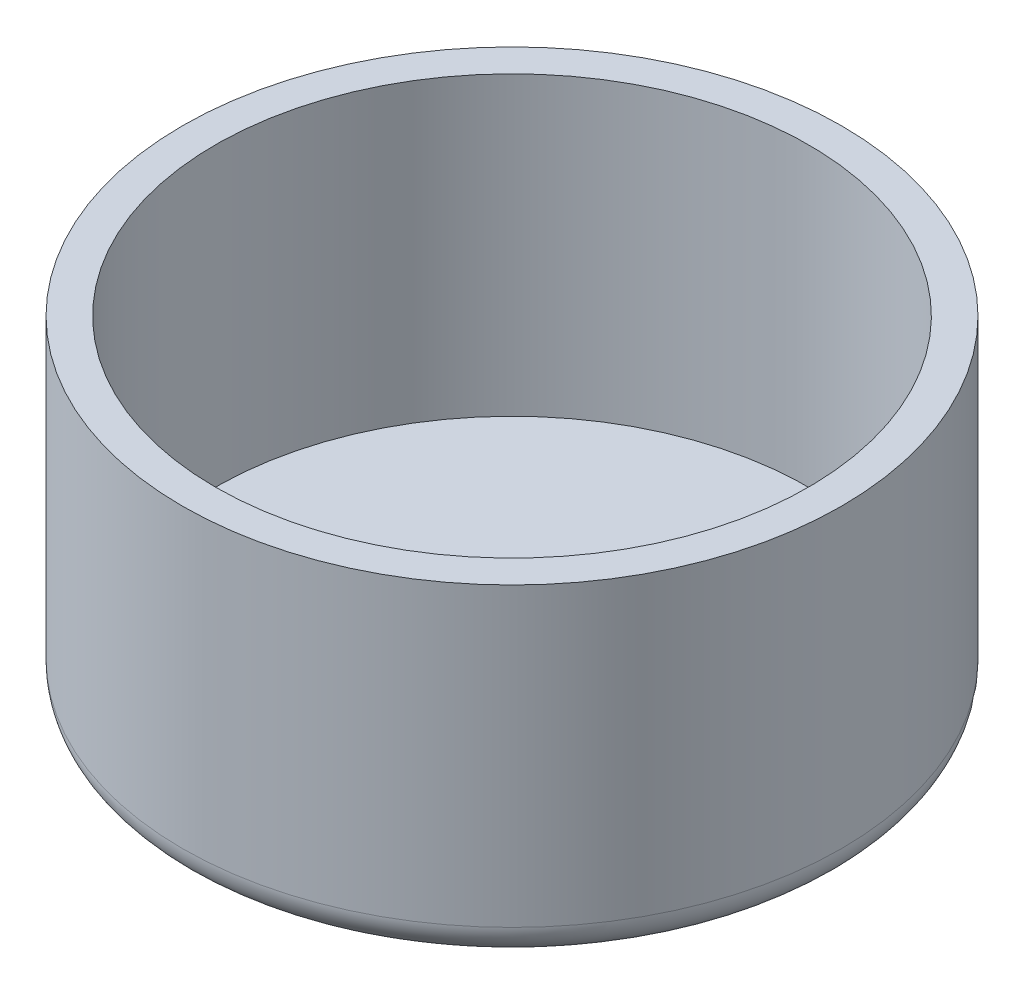
ISO-10303-21;
HEADER;
FILE_DESCRIPTION(('STEP AP214'),'2;1');
FILE_NAME('part.step','',(''),(''),'','','');
FILE_SCHEMA(('AUTOMOTIVE_DESIGN { 1 0 10303 214 1 1 1 1 }'));
ENDSEC;
DATA;
#1=APPLICATION_CONTEXT('core data for automotive mechanical design processes');
#2=APPLICATION_PROTOCOL_DEFINITION('international standard','automotive_design',2000,#1);
#3=PRODUCT_CONTEXT('',#1,'mechanical');
#4=PRODUCT('Part','Part','',(#3));
#5=PRODUCT_RELATED_PRODUCT_CATEGORY('part','',(#4));
#6=PRODUCT_DEFINITION_FORMATION('','',#4);
#7=PRODUCT_DEFINITION_CONTEXT('part definition',#1,'design');
#8=PRODUCT_DEFINITION('design','',#6,#7);
#9=PRODUCT_DEFINITION_SHAPE('','',#8);
#10=(LENGTH_UNIT() NAMED_UNIT(*) SI_UNIT(.MILLI.,.METRE.));
#11=(NAMED_UNIT(*) PLANE_ANGLE_UNIT() SI_UNIT($,.RADIAN.));
#12=(NAMED_UNIT(*) SI_UNIT($,.STERADIAN.) SOLID_ANGLE_UNIT());
#13=UNCERTAINTY_MEASURE_WITH_UNIT(LENGTH_MEASURE(1.E-05),#10,'distance_accuracy_value','');
#14=(GEOMETRIC_REPRESENTATION_CONTEXT(3) GLOBAL_UNCERTAINTY_ASSIGNED_CONTEXT((#13)) GLOBAL_UNIT_ASSIGNED_CONTEXT((#10,
#11,#12)) REPRESENTATION_CONTEXT('',''));
#15=CARTESIAN_POINT('',(0.,0.,0.));
#16=DIRECTION('',(0.,0.,1.));
#17=DIRECTION('',(1.,0.,0.));
#18=AXIS2_PLACEMENT_3D('',#15,#16,#17);
#19=CARTESIAN_POINT('',(0.,100.,0.));
#20=DIRECTION('',(0.,-1.,0.));
#21=DIRECTION('',(0.,0.,-1.));
#22=AXIS2_PLACEMENT_3D('',#19,#20,#21);
#23=CYLINDRICAL_SURFACE('',#22,100.);
#24=CARTESIAN_POINT('',(0.,9.99999999999999,0.));
#25=DIRECTION('',(0.,1.,0.));
#26=DIRECTION('',(0.,0.,1.));
#27=AXIS2_PLACEMENT_3D('',#24,#25,#26);
#28=CIRCLE('',#27,100.);
#29=CARTESIAN_POINT('',(0.,9.99999999999999,100.));
#30=VERTEX_POINT('',#29);
#31=EDGE_CURVE('E48',#30,#30,#28,.T.);
#32=ORIENTED_EDGE('',*,*,#31,.T.);
#33=EDGE_LOOP('',(#32));
#34=FACE_BOUND('',#33,.T.);
#35=CARTESIAN_POINT('',(0.,100.,0.));
#36=DIRECTION('',(0.,1.,0.));
#37=DIRECTION('',(0.,0.,1.));
#38=AXIS2_PLACEMENT_3D('',#35,#36,#37);
#39=CIRCLE('',#38,100.);
#40=CARTESIAN_POINT('',(0.,100.,100.));
#41=VERTEX_POINT('',#40);
#42=EDGE_CURVE('E52',#41,#41,#39,.T.);
#43=ORIENTED_EDGE('',*,*,#42,.F.);
#44=EDGE_LOOP('',(#43));
#45=FACE_BOUND('',#44,.T.);
#46=ADVANCED_FACE('F37',(#34,#45),#23,.T.);
#47=CARTESIAN_POINT('',(0.,100.,0.));
#48=DIRECTION('',(0.,1.,0.));
#49=DIRECTION('',(0.,0.,1.));
#50=AXIS2_PLACEMENT_3D('',#47,#48,#49);
#51=PLANE('',#50);
#52=CARTESIAN_POINT('',(0.,100.,0.));
#53=DIRECTION('',(0.,1.,0.));
#54=DIRECTION('',(0.,0.,1.));
#55=AXIS2_PLACEMENT_3D('',#52,#53,#54);
#56=CIRCLE('',#55,90.);
#57=CARTESIAN_POINT('',(0.,100.,90.));
#58=VERTEX_POINT('',#57);
#59=EDGE_CURVE('E58',#58,#58,#56,.T.);
#60=ORIENTED_EDGE('',*,*,#59,.F.);
#61=EDGE_LOOP('',(#60));
#62=FACE_BOUND('',#61,.T.);
#63=ORIENTED_EDGE('',*,*,#42,.T.);
#64=EDGE_LOOP('',(#63));
#65=FACE_BOUND('',#64,.T.);
#66=ADVANCED_FACE('F98',(#62,#65),#51,.T.);
#67=CARTESIAN_POINT('',(0.,0.,0.));
#68=DIRECTION('',(0.,1.,0.));
#69=DIRECTION('',(0.,0.,1.));
#70=AXIS2_PLACEMENT_3D('',#67,#68,#69);
#71=PLANE('',#70);
#72=CARTESIAN_POINT('',(0.,0.,0.));
#73=DIRECTION('',(0.,1.,0.));
#74=DIRECTION('',(0.,0.,1.));
#75=AXIS2_PLACEMENT_3D('',#72,#73,#74);
#76=CIRCLE('',#75,5.);
#77=CARTESIAN_POINT('',(0.,0.,5.));
#78=VERTEX_POINT('',#77);
#79=EDGE_CURVE('E10',#78,#78,#76,.F.);
#80=ORIENTED_EDGE('',*,*,#79,.F.);
#81=EDGE_LOOP('',(#80));
#82=FACE_BOUND('',#81,.T.);
#83=CARTESIAN_POINT('',(0.,0.,0.));
#84=DIRECTION('',(0.,1.,0.));
#85=DIRECTION('',(0.,0.,1.));
#86=AXIS2_PLACEMENT_3D('',#83,#84,#85);
#87=CIRCLE('',#86,90.);
#88=CARTESIAN_POINT('',(0.,0.,90.));
#89=VERTEX_POINT('',#88);
#90=EDGE_CURVE('E44',#89,#89,#87,.F.);
#91=ORIENTED_EDGE('',*,*,#90,.T.);
#92=EDGE_LOOP('',(#91));
#93=FACE_BOUND('',#92,.T.);
#94=ADVANCED_FACE('F104',(#82,#93),#71,.F.);
#95=CARTESIAN_POINT('',(0.,10.,0.));
#96=DIRECTION('',(0.,1.,0.));
#97=DIRECTION('',(0.,0.,1.));
#98=AXIS2_PLACEMENT_3D('',#95,#96,#97);
#99=CYLINDRICAL_SURFACE('',#98,90.);
#100=CARTESIAN_POINT('',(0.,10.,0.));
#101=DIRECTION('',(0.,1.,0.));
#102=DIRECTION('',(0.,0.,1.));
#103=AXIS2_PLACEMENT_3D('',#100,#101,#102);
#104=CIRCLE('',#103,90.);
#105=CARTESIAN_POINT('',(0.,10.,90.));
#106=VERTEX_POINT('',#105);
#107=EDGE_CURVE('E57',#106,#106,#104,.T.);
#108=CARTESIAN_POINT('',(0.,10.,90.));
#109=CARTESIAN_POINT('',(0.,10.9375,90.));
#110=CARTESIAN_POINT('',(0.,11.875,90.));
#111=CARTESIAN_POINT('',(0.,13.75,90.));
#112=CARTESIAN_POINT('',(0.,14.6875,90.));
#113=CARTESIAN_POINT('',(0.,16.5625,90.));
#114=CARTESIAN_POINT('',(0.,17.5,90.));
#115=CARTESIAN_POINT('',(0.,19.375,90.));
#116=CARTESIAN_POINT('',(0.,20.3125,90.));
#117=CARTESIAN_POINT('',(0.,22.1875,90.));
#118=CARTESIAN_POINT('',(0.,23.125,90.));
#119=CARTESIAN_POINT('',(0.,25.,90.));
#120=CARTESIAN_POINT('',(0.,25.9375,90.));
#121=CARTESIAN_POINT('',(0.,27.8125,90.));
#122=CARTESIAN_POINT('',(0.,28.75,90.));
#123=CARTESIAN_POINT('',(0.,30.625,90.));
#124=CARTESIAN_POINT('',(0.,31.5625,90.));
#125=CARTESIAN_POINT('',(0.,33.4375,90.));
#126=CARTESIAN_POINT('',(0.,34.375,90.));
#127=CARTESIAN_POINT('',(0.,36.25,90.));
#128=CARTESIAN_POINT('',(0.,37.1875,90.));
#129=CARTESIAN_POINT('',(0.,39.0625,90.));
#130=CARTESIAN_POINT('',(0.,40.,90.));
#131=CARTESIAN_POINT('',(0.,41.875,90.));
#132=CARTESIAN_POINT('',(0.,42.8125,90.));
#133=CARTESIAN_POINT('',(0.,44.6875,90.));
#134=CARTESIAN_POINT('',(0.,45.625,90.));
#135=CARTESIAN_POINT('',(0.,47.5,90.));
#136=CARTESIAN_POINT('',(0.,48.4375,90.));
#137=CARTESIAN_POINT('',(0.,50.3125,90.));
#138=CARTESIAN_POINT('',(0.,51.25,90.));
#139=CARTESIAN_POINT('',(0.,53.125,90.));
#140=CARTESIAN_POINT('',(0.,54.0625,90.));
#141=CARTESIAN_POINT('',(0.,55.9375,90.));
#142=CARTESIAN_POINT('',(0.,56.875,90.));
#143=CARTESIAN_POINT('',(0.,58.75,90.));
#144=CARTESIAN_POINT('',(0.,59.6875,90.));
#145=CARTESIAN_POINT('',(0.,61.5625,90.));
#146=CARTESIAN_POINT('',(0.,62.5,90.));
#147=CARTESIAN_POINT('',(0.,64.375,90.));
#148=CARTESIAN_POINT('',(0.,65.3125,90.));
#149=CARTESIAN_POINT('',(0.,67.1875,90.));
#150=CARTESIAN_POINT('',(0.,68.125,90.));
#151=CARTESIAN_POINT('',(0.,70.,90.));
#152=CARTESIAN_POINT('',(0.,70.9375,90.));
#153=CARTESIAN_POINT('',(0.,72.8125,90.));
#154=CARTESIAN_POINT('',(0.,73.75,90.));
#155=CARTESIAN_POINT('',(0.,75.625,90.));
#156=CARTESIAN_POINT('',(0.,76.5625,90.));
#157=CARTESIAN_POINT('',(0.,78.4375,90.));
#158=CARTESIAN_POINT('',(0.,79.375,90.));
#159=CARTESIAN_POINT('',(0.,81.25,90.));
#160=CARTESIAN_POINT('',(0.,82.1875,90.));
#161=CARTESIAN_POINT('',(0.,84.0625,90.));
#162=CARTESIAN_POINT('',(0.,85.,90.));
#163=CARTESIAN_POINT('',(0.,86.875,90.));
#164=CARTESIAN_POINT('',(0.,87.8125,90.));
#165=CARTESIAN_POINT('',(0.,89.6875,90.));
#166=CARTESIAN_POINT('',(0.,90.625,90.));
#167=CARTESIAN_POINT('',(0.,92.5,90.));
#168=CARTESIAN_POINT('',(0.,93.4375,90.));
#169=CARTESIAN_POINT('',(0.,95.3125,90.));
#170=CARTESIAN_POINT('',(0.,96.25,90.));
#171=CARTESIAN_POINT('',(0.,98.125,90.));
#172=CARTESIAN_POINT('',(0.,99.0625,90.));
#173=CARTESIAN_POINT('',(0.,100.,90.));
#174=B_SPLINE_CURVE_WITH_KNOTS('',3,(#108,#109,#110,#111,#112,#113,#114,#115,#116,#117,#118,
#119,#120,#121,#122,#123,#124,#125,#126,#127,#128,#129,#130,#131,#132,#133,#134,#135,#136,#137,
#138,#139,#140,#141,#142,#143,#144,#145,#146,#147,#148,#149,#150,#151,#152,#153,#154,#155,#156,
#157,#158,#159,#160,#161,#162,#163,#164,#165,#166,#167,#168,#169,#170,#171,#172,#173),
.UNSPECIFIED.,.F.,.F.,(4,2,2,2,2,2,2,2,2,2,2,2,2,2,2,2,2,2,2,2,2,2,2,2,2,2,2,2,2,2,2,2,4),(0.,
2.8125,5.625,8.4375,11.25,14.0625,16.875,19.6875,22.5,25.3125,28.125,30.9375,33.75,36.5625,
39.375,42.1875,45.,47.8125,50.625,53.4375,56.25,59.0625,61.875,64.6875,67.5,70.3125,73.125,
75.9375,78.75,81.5625,84.375,87.1875,90.),.UNSPECIFIED.);
#175=EDGE_CURVE('BSEAM109',#106,#58,#174,.T.);
#176=ORIENTED_EDGE('',*,*,#107,.F.);
#177=ORIENTED_EDGE('',*,*,#59,.T.);
#178=ORIENTED_EDGE('',*,*,#175,.T.);
#179=ORIENTED_EDGE('',*,*,#175,.F.);
#180=EDGE_LOOP('',(#176,#178,#177,#179));
#181=FACE_BOUND('',#180,.T.);
#182=ADVANCED_FACE('F109',(#181),#99,.F.);
#183=CARTESIAN_POINT('',(0.,10.,0.));
#184=DIRECTION('',(0.,1.,0.));
#185=DIRECTION('',(0.,0.,1.));
#186=AXIS2_PLACEMENT_3D('',#183,#184,#185);
#187=PLANE('',#186);
#188=ORIENTED_EDGE('',*,*,#107,.T.);
#189=EDGE_LOOP('',(#188));
#190=FACE_BOUND('',#189,.T.);
#191=ADVANCED_FACE('F94',(#190),#187,.T.);
#192=CARTESIAN_POINT('',(0.,9.99999999999999,0.));
#193=DIRECTION('',(0.,1.,0.));
#194=DIRECTION('',(0.,0.,1.));
#195=AXIS2_PLACEMENT_3D('',#192,#193,#194);
#196=TOROIDAL_SURFACE('',#195,90.,10.);
#197=ORIENTED_EDGE('',*,*,#90,.F.);
#198=EDGE_LOOP('',(#197));
#199=FACE_BOUND('',#198,.T.);
#200=ORIENTED_EDGE('',*,*,#31,.F.);
#201=EDGE_LOOP('',(#200));
#202=FACE_BOUND('',#201,.T.);
#203=ADVANCED_FACE('F39',(#199,#202),#196,.T.);
#204=CARTESIAN_POINT('',(0.,-5.,0.));
#205=DIRECTION('',(0.,1.,0.));
#206=DIRECTION('',(0.,0.,1.));
#207=AXIS2_PLACEMENT_3D('',#204,#205,#206);
#208=CYLINDRICAL_SURFACE('',#207,5.);
#209=CARTESIAN_POINT('',(0.,-5.,0.));
#210=DIRECTION('',(0.,-1.,0.));
#211=DIRECTION('',(0.,0.,-1.));
#212=AXIS2_PLACEMENT_3D('',#209,#210,#211);
#213=CIRCLE('',#212,5.);
#214=CARTESIAN_POINT('',(0.,-5.,-5.));
#215=VERTEX_POINT('',#214);
#216=EDGE_CURVE('E61',#215,#215,#213,.T.);
#217=ORIENTED_EDGE('',*,*,#216,.F.);
#218=EDGE_LOOP('',(#217));
#219=FACE_BOUND('',#218,.T.);
#220=ORIENTED_EDGE('',*,*,#79,.T.);
#221=EDGE_LOOP('',(#220));
#222=FACE_BOUND('',#221,.T.);
#223=ADVANCED_FACE('F84',(#219,#222),#208,.T.);
#224=CARTESIAN_POINT('',(0.,-5.,0.));
#225=DIRECTION('',(0.,-1.,0.));
#226=DIRECTION('',(0.,0.,-1.));
#227=AXIS2_PLACEMENT_3D('',#224,#225,#226);
#228=PLANE('',#227);
#229=CARTESIAN_POINT('',(0.,-5.,0.));
#230=DIRECTION('',(0.,-1.,0.));
#231=DIRECTION('',(0.,0.,-1.));
#232=AXIS2_PLACEMENT_3D('',#229,#230,#231);
#233=CIRCLE('',#232,3.);
#234=CARTESIAN_POINT('',(0.,-5.,-3.));
#235=VERTEX_POINT('',#234);
#236=EDGE_CURVE('E67',#235,#235,#233,.T.);
#237=ORIENTED_EDGE('',*,*,#236,.F.);
#238=EDGE_LOOP('',(#237));
#239=FACE_BOUND('',#238,.T.);
#240=ORIENTED_EDGE('',*,*,#216,.T.);
#241=EDGE_LOOP('',(#240));
#242=FACE_BOUND('',#241,.T.);
#243=ADVANCED_FACE('F78',(#239,#242),#228,.T.);
#244=CARTESIAN_POINT('',(0.,0.,0.));
#245=DIRECTION('',(0.,-1.,0.));
#246=DIRECTION('',(0.,0.,-1.));
#247=AXIS2_PLACEMENT_3D('',#244,#245,#246);
#248=CYLINDRICAL_SURFACE('',#247,3.);
#249=CARTESIAN_POINT('',(0.,0.,0.));
#250=DIRECTION('',(0.,-1.,0.));
#251=DIRECTION('',(0.,0.,-1.));
#252=AXIS2_PLACEMENT_3D('',#249,#250,#251);
#253=CIRCLE('',#252,3.);
#254=CARTESIAN_POINT('',(0.,0.,-3.));
#255=VERTEX_POINT('',#254);
#256=EDGE_CURVE('E66',#255,#255,#253,.T.);
#257=ORIENTED_EDGE('',*,*,#256,.F.);
#258=EDGE_LOOP('',(#257));
#259=FACE_BOUND('',#258,.T.);
#260=ORIENTED_EDGE('',*,*,#236,.T.);
#261=EDGE_LOOP('',(#260));
#262=FACE_BOUND('',#261,.T.);
#263=ADVANCED_FACE('F75',(#259,#262),#248,.F.);
#264=CARTESIAN_POINT('',(0.,0.,0.));
#265=DIRECTION('',(0.,-1.,0.));
#266=DIRECTION('',(0.,0.,-1.));
#267=AXIS2_PLACEMENT_3D('',#264,#265,#266);
#268=PLANE('',#267);
#269=ORIENTED_EDGE('',*,*,#256,.T.);
#270=EDGE_LOOP('',(#269));
#271=FACE_BOUND('',#270,.T.);
#272=ADVANCED_FACE('F73',(#271),#268,.T.);
#273=CLOSED_SHELL('',(#46,#66,#94,#182,#191,#203,#223,#243,#263,#272));
#274=MANIFOLD_SOLID_BREP('B2',#273);
#275=ADVANCED_BREP_SHAPE_REPRESENTATION('',(#18,#274),#14);
#276=SHAPE_DEFINITION_REPRESENTATION(#9,#275);
ENDSEC;
END-ISO-10303-21;
